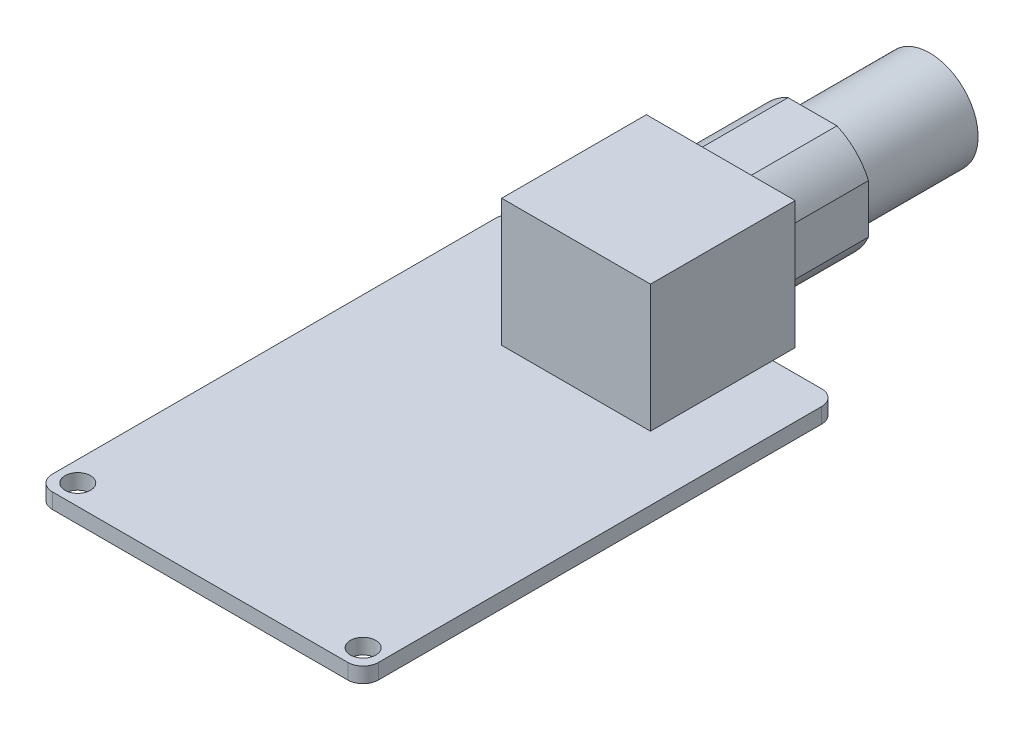
ISO-10303-21;
HEADER;
FILE_DESCRIPTION(('STEP AP214'),'2;1');
FILE_NAME('part.step','',(''),(''),'','','');
FILE_SCHEMA(('AUTOMOTIVE_DESIGN { 1 0 10303 214 1 1 1 1 }'));
ENDSEC;
DATA;
#1=APPLICATION_CONTEXT('core data for automotive mechanical design processes');
#2=APPLICATION_PROTOCOL_DEFINITION('international standard','automotive_design',2000,#1);
#3=PRODUCT_CONTEXT('',#1,'mechanical');
#4=PRODUCT('Part','Part','',(#3));
#5=PRODUCT_RELATED_PRODUCT_CATEGORY('part','',(#4));
#6=PRODUCT_DEFINITION_FORMATION('','',#4);
#7=PRODUCT_DEFINITION_CONTEXT('part definition',#1,'design');
#8=PRODUCT_DEFINITION('design','',#6,#7);
#9=PRODUCT_DEFINITION_SHAPE('','',#8);
#10=(LENGTH_UNIT() NAMED_UNIT(*) SI_UNIT(.MILLI.,.METRE.));
#11=(NAMED_UNIT(*) PLANE_ANGLE_UNIT() SI_UNIT($,.RADIAN.));
#12=(NAMED_UNIT(*) SI_UNIT($,.STERADIAN.) SOLID_ANGLE_UNIT());
#13=UNCERTAINTY_MEASURE_WITH_UNIT(LENGTH_MEASURE(1.E-05),#10,'distance_accuracy_value','');
#14=(GEOMETRIC_REPRESENTATION_CONTEXT(3) GLOBAL_UNCERTAINTY_ASSIGNED_CONTEXT((#13)) GLOBAL_UNIT_ASSIGNED_CONTEXT((#10,
#11,#12)) REPRESENTATION_CONTEXT('',''));
#15=CARTESIAN_POINT('',(0.,0.,0.));
#16=DIRECTION('',(0.,0.,1.));
#17=DIRECTION('',(1.,0.,0.));
#18=AXIS2_PLACEMENT_3D('',#15,#16,#17);
#19=CARTESIAN_POINT('',(-29.3409090909091,31.5,3.5));
#20=DIRECTION('',(0.,0.,-1.));
#21=DIRECTION('',(-1.,0.,0.));
#22=AXIS2_PLACEMENT_3D('',#19,#20,#21);
#23=CYLINDRICAL_SURFACE('',#22,6.);
#24=CARTESIAN_POINT('',(-29.3409090909091,31.5,3.5));
#25=DIRECTION('',(0.,0.,1.));
#26=DIRECTION('',(1.,0.,0.));
#27=AXIS2_PLACEMENT_3D('',#24,#25,#26);
#28=CIRCLE('',#27,6.);
#29=CARTESIAN_POINT('',(-26.9429933292527,26.,3.5));
#30=VERTEX_POINT('',#29);
#31=CARTESIAN_POINT('',(-23.8409090909091,29.1020842383436,3.5));
#32=VERTEX_POINT('',#31);
#33=EDGE_CURVE('E196',#30,#32,#28,.T.);
#34=ORIENTED_EDGE('',*,*,#33,.F.);
#35=DIRECTION('',(0.,0.,-1.));
#36=VECTOR('',#35,1.);
#37=CARTESIAN_POINT('',(-26.9429933292527,26.,8.3218253804965));
#38=LINE('',#37,#36);
#39=CARTESIAN_POINT('',(-26.9429933292527,26.,-5.5));
#40=VERTEX_POINT('',#39);
#41=EDGE_CURVE('E182',#30,#40,#38,.T.);
#42=ORIENTED_EDGE('',*,*,#41,.T.);
#43=CARTESIAN_POINT('',(-29.3409090909091,31.5,-5.5));
#44=DIRECTION('',(0.,0.,1.));
#45=DIRECTION('',(1.,0.,0.));
#46=AXIS2_PLACEMENT_3D('',#43,#44,#45);
#47=CIRCLE('',#46,6.);
#48=CARTESIAN_POINT('',(-23.8409090909091,29.1020842383436,-5.5));
#49=VERTEX_POINT('',#48);
#50=EDGE_CURVE('E195',#40,#49,#47,.T.);
#51=ORIENTED_EDGE('',*,*,#50,.T.);
#52=DIRECTION('',(0.,0.,-1.));
#53=VECTOR('',#52,1.);
#54=CARTESIAN_POINT('',(-23.8409090909091,29.1020842383436,8.3218253804965));
#55=LINE('',#54,#53);
#56=EDGE_CURVE('E231',#32,#49,#55,.T.);
#57=ORIENTED_EDGE('',*,*,#56,.F.);
#58=EDGE_LOOP('',(#34,#42,#51,#57));
#59=FACE_BOUND('',#58,.T.);
#60=ADVANCED_FACE('F33',(#59),#23,.T.);
#61=CARTESIAN_POINT('',(-31.7388248525654,37.,3.5));
#62=VERTEX_POINT('',#61);
#63=CARTESIAN_POINT('',(-34.8409090909091,33.8979157616564,3.5));
#64=VERTEX_POINT('',#63);
#65=EDGE_CURVE('E354',#62,#64,#28,.T.);
#66=ORIENTED_EDGE('',*,*,#65,.F.);
#67=DIRECTION('',(0.,0.,-1.));
#68=VECTOR('',#67,1.);
#69=CARTESIAN_POINT('',(-31.7388248525654,37.,8.3218253804965));
#70=LINE('',#69,#68);
#71=CARTESIAN_POINT('',(-31.7388248525654,37.,-5.5));
#72=VERTEX_POINT('',#71);
#73=EDGE_CURVE('E224',#62,#72,#70,.T.);
#74=ORIENTED_EDGE('',*,*,#73,.T.);
#75=CARTESIAN_POINT('',(-34.8409090909091,33.8979157616564,-5.5));
#76=VERTEX_POINT('',#75);
#77=EDGE_CURVE('E205',#72,#76,#47,.T.);
#78=ORIENTED_EDGE('',*,*,#77,.T.);
#79=DIRECTION('',(0.,0.,-1.));
#80=VECTOR('',#79,1.);
#81=CARTESIAN_POINT('',(-34.8409090909091,33.8979157616564,8.3218253804965));
#82=LINE('',#81,#80);
#83=EDGE_CURVE('E222',#64,#76,#82,.T.);
#84=ORIENTED_EDGE('',*,*,#83,.F.);
#85=EDGE_LOOP('',(#66,#74,#78,#84));
#86=FACE_BOUND('',#85,.T.);
#87=ADVANCED_FACE('F221',(#86),#23,.T.);
#88=CARTESIAN_POINT('',(-34.8409090909091,29.1020842383436,-5.5));
#89=VERTEX_POINT('',#88);
#90=CARTESIAN_POINT('',(-31.7388248525654,26.,-5.5));
#91=VERTEX_POINT('',#90);
#92=EDGE_CURVE('E202',#89,#91,#47,.T.);
#93=ORIENTED_EDGE('',*,*,#92,.T.);
#94=DIRECTION('',(0.,0.,-1.));
#95=VECTOR('',#94,1.);
#96=CARTESIAN_POINT('',(-31.7388248525654,26.,8.3218253804965));
#97=LINE('',#96,#95);
#98=CARTESIAN_POINT('',(-31.7388248525654,26.,3.5));
#99=VERTEX_POINT('',#98);
#100=EDGE_CURVE('E185',#99,#91,#97,.T.);
#101=ORIENTED_EDGE('',*,*,#100,.F.);
#102=CARTESIAN_POINT('',(-34.8409090909091,29.1020842383436,3.5));
#103=VERTEX_POINT('',#102);
#104=EDGE_CURVE('E214',#103,#99,#28,.T.);
#105=ORIENTED_EDGE('',*,*,#104,.F.);
#106=DIRECTION('',(0.,0.,-1.));
#107=VECTOR('',#106,1.);
#108=CARTESIAN_POINT('',(-34.8409090909091,29.1020842383436,8.3218253804965));
#109=LINE('',#108,#107);
#110=EDGE_CURVE('E233',#103,#89,#109,.T.);
#111=ORIENTED_EDGE('',*,*,#110,.T.);
#112=EDGE_LOOP('',(#93,#101,#105,#111));
#113=FACE_BOUND('',#112,.T.);
#114=ADVANCED_FACE('F360',(#113),#23,.T.);
#115=CARTESIAN_POINT('',(-36.6409090909091,25.1,17.7));
#116=DIRECTION('',(0.,1.,0.));
#117=DIRECTION('',(0.,0.,1.));
#118=AXIS2_PLACEMENT_3D('',#115,#116,#117);
#119=PLANE('',#118);
#120=DIRECTION('',(1.,0.,0.));
#121=VECTOR('',#120,1.);
#122=CARTESIAN_POINT('',(-17.2409090909091,25.1,5.69742249083508));
#123=LINE('',#122,#121);
#124=CARTESIAN_POINT('',(-36.6409090909091,25.1,5.69742249083508));
#125=VERTEX_POINT('',#124);
#126=CARTESIAN_POINT('',(-22.0409090909091,25.1,5.69742249083508));
#127=VERTEX_POINT('',#126);
#128=EDGE_CURVE('E11',#125,#127,#123,.T.);
#129=ORIENTED_EDGE('',*,*,#128,.F.);
#130=DIRECTION('',(0.,0.,-1.));
#131=VECTOR('',#130,1.);
#132=CARTESIAN_POINT('',(-36.6409090909091,25.1,17.7));
#133=LINE('',#132,#131);
#134=CARTESIAN_POINT('',(-36.6409090909091,25.1,3.5));
#135=VERTEX_POINT('',#134);
#136=EDGE_CURVE('E342',#125,#135,#133,.T.);
#137=ORIENTED_EDGE('',*,*,#136,.T.);
#138=DIRECTION('',(1.,0.,0.));
#139=VECTOR('',#138,1.);
#140=CARTESIAN_POINT('',(-36.6409090909091,25.1,3.5));
#141=LINE('',#140,#139);
#142=CARTESIAN_POINT('',(-22.0409090909091,25.1,3.5));
#143=VERTEX_POINT('',#142);
#144=EDGE_CURVE('E328',#135,#143,#141,.T.);
#145=ORIENTED_EDGE('',*,*,#144,.T.);
#146=DIRECTION('',(0.,0.,-1.));
#147=VECTOR('',#146,1.);
#148=CARTESIAN_POINT('',(-22.0409090909091,25.1,17.7));
#149=LINE('',#148,#147);
#150=EDGE_CURVE('E339',#127,#143,#149,.T.);
#151=ORIENTED_EDGE('',*,*,#150,.F.);
#152=EDGE_LOOP('',(#129,#137,#145,#151));
#153=FACE_BOUND('',#152,.T.);
#154=ADVANCED_FACE('F388',(#153),#119,.F.);
#155=CARTESIAN_POINT('',(-23.8409090909091,33.8979157616564,-5.5));
#156=VERTEX_POINT('',#155);
#157=CARTESIAN_POINT('',(-26.9429933292527,37.,-5.5));
#158=VERTEX_POINT('',#157);
#159=EDGE_CURVE('E204',#156,#158,#47,.T.);
#160=ORIENTED_EDGE('',*,*,#159,.T.);
#161=DIRECTION('',(0.,0.,-1.));
#162=VECTOR('',#161,1.);
#163=CARTESIAN_POINT('',(-26.9429933292527,37.,8.3218253804965));
#164=LINE('',#163,#162);
#165=CARTESIAN_POINT('',(-26.9429933292527,37.,3.5));
#166=VERTEX_POINT('',#165);
#167=EDGE_CURVE('E190',#166,#158,#164,.T.);
#168=ORIENTED_EDGE('',*,*,#167,.F.);
#169=CARTESIAN_POINT('',(-23.8409090909091,33.8979157616564,3.5));
#170=VERTEX_POINT('',#169);
#171=EDGE_CURVE('E37',#170,#166,#28,.T.);
#172=ORIENTED_EDGE('',*,*,#171,.F.);
#173=DIRECTION('',(0.,0.,-1.));
#174=VECTOR('',#173,1.);
#175=CARTESIAN_POINT('',(-23.8409090909091,33.8979157616564,8.3218253804965));
#176=LINE('',#175,#174);
#177=EDGE_CURVE('E235',#170,#156,#176,.T.);
#178=ORIENTED_EDGE('',*,*,#177,.T.);
#179=EDGE_LOOP('',(#160,#168,#172,#178));
#180=FACE_BOUND('',#179,.T.);
#181=ADVANCED_FACE('F35',(#180),#23,.T.);
#182=CARTESIAN_POINT('',(-29.3409090909091,31.5,-5.5));
#183=DIRECTION('',(0.,0.,1.));
#184=DIRECTION('',(1.,0.,0.));
#185=AXIS2_PLACEMENT_3D('',#182,#183,#184);
#186=PLANE('',#185);
#187=CARTESIAN_POINT('',(-29.3409090909091,31.5,-5.5));
#188=DIRECTION('',(0.,0.,-1.));
#189=DIRECTION('',(-1.,0.,0.));
#190=AXIS2_PLACEMENT_3D('',#187,#188,#189);
#191=CIRCLE('',#190,4.75000000000001);
#192=CARTESIAN_POINT('',(-34.0909090909091,31.5,-5.5));
#193=VERTEX_POINT('',#192);
#194=EDGE_CURVE('E42',#193,#193,#191,.T.);
#195=ORIENTED_EDGE('',*,*,#194,.F.);
#196=EDGE_LOOP('',(#195));
#197=FACE_BOUND('',#196,.T.);
#198=ORIENTED_EDGE('',*,*,#50,.F.);
#199=DIRECTION('',(1.,0.,0.));
#200=VECTOR('',#199,1.);
#201=CARTESIAN_POINT('',(-26.9429933292527,26.,-5.5));
#202=LINE('',#201,#200);
#203=EDGE_CURVE('E179',#91,#40,#202,.T.);
#204=ORIENTED_EDGE('',*,*,#203,.F.);
#205=ORIENTED_EDGE('',*,*,#92,.F.);
#206=DIRECTION('',(0.,-1.,0.));
#207=VECTOR('',#206,1.);
#208=CARTESIAN_POINT('',(-34.8409090909091,29.1020842383436,-5.5));
#209=LINE('',#208,#207);
#210=EDGE_CURVE('E228',#76,#89,#209,.T.);
#211=ORIENTED_EDGE('',*,*,#210,.F.);
#212=ORIENTED_EDGE('',*,*,#77,.F.);
#213=DIRECTION('',(-1.,0.,0.));
#214=VECTOR('',#213,1.);
#215=CARTESIAN_POINT('',(-26.9429933292527,37.,-5.5));
#216=LINE('',#215,#214);
#217=EDGE_CURVE('E227',#158,#72,#216,.T.);
#218=ORIENTED_EDGE('',*,*,#217,.F.);
#219=ORIENTED_EDGE('',*,*,#159,.F.);
#220=DIRECTION('',(0.,1.,0.));
#221=VECTOR('',#220,1.);
#222=CARTESIAN_POINT('',(-23.8409090909091,29.1020842383436,-5.5));
#223=LINE('',#222,#221);
#224=EDGE_CURVE('E201',#49,#156,#223,.T.);
#225=ORIENTED_EDGE('',*,*,#224,.F.);
#226=EDGE_LOOP('',(#198,#204,#205,#211,#212,#218,#219,#225));
#227=FACE_BOUND('',#226,.T.);
#228=ADVANCED_FACE('F199',(#197,#227),#186,.F.);
#229=CARTESIAN_POINT('',(-29.3409090909091,31.5,-17.));
#230=DIRECTION('',(0.,0.,1.));
#231=DIRECTION('',(1.,0.,0.));
#232=AXIS2_PLACEMENT_3D('',#229,#230,#231);
#233=CYLINDRICAL_SURFACE('',#232,4.75000000000001);
#234=CARTESIAN_POINT('',(-29.3409090909091,31.5,-17.));
#235=DIRECTION('',(0.,0.,-1.));
#236=DIRECTION('',(-1.,0.,0.));
#237=AXIS2_PLACEMENT_3D('',#234,#235,#236);
#238=CIRCLE('',#237,4.75000000000001);
#239=CARTESIAN_POINT('',(-34.0909090909091,31.5,-17.));
#240=VERTEX_POINT('',#239);
#241=EDGE_CURVE('E203',#240,#240,#238,.T.);
#242=ORIENTED_EDGE('',*,*,#241,.F.);
#243=EDGE_LOOP('',(#242));
#244=FACE_BOUND('',#243,.T.);
#245=ORIENTED_EDGE('',*,*,#194,.T.);
#246=EDGE_LOOP('',(#245));
#247=FACE_BOUND('',#246,.T.);
#248=ADVANCED_FACE('F393',(#244,#247),#233,.T.);
#249=CARTESIAN_POINT('',(-29.3409090909091,31.5,-17.));
#250=DIRECTION('',(0.,0.,-1.));
#251=DIRECTION('',(-1.,0.,0.));
#252=AXIS2_PLACEMENT_3D('',#249,#250,#251);
#253=PLANE('',#252);
#254=CARTESIAN_POINT('',(-29.3409090909091,31.5,-17.));
#255=DIRECTION('',(0.,0.,-1.));
#256=DIRECTION('',(-1.,0.,0.));
#257=AXIS2_PLACEMENT_3D('',#254,#255,#256);
#258=CIRCLE('',#257,4.25000000000001);
#259=CARTESIAN_POINT('',(-33.5909090909091,31.5,-17.));
#260=VERTEX_POINT('',#259);
#261=EDGE_CURVE('E346',#260,#260,#258,.T.);
#262=ORIENTED_EDGE('',*,*,#261,.F.);
#263=EDGE_LOOP('',(#262));
#264=FACE_BOUND('',#263,.T.);
#265=ORIENTED_EDGE('',*,*,#241,.T.);
#266=EDGE_LOOP('',(#265));
#267=FACE_BOUND('',#266,.T.);
#268=ADVANCED_FACE('F626',(#264,#267),#253,.T.);
#269=CARTESIAN_POINT('',(-29.3409090909091,31.5,-5.5));
#270=DIRECTION('',(0.,0.,-1.));
#271=DIRECTION('',(-1.,0.,0.));
#272=AXIS2_PLACEMENT_3D('',#269,#270,#271);
#273=CYLINDRICAL_SURFACE('',#272,4.25000000000001);
#274=CARTESIAN_POINT('',(-29.3409090909091,31.5,-5.5));
#275=DIRECTION('',(0.,0.,-1.));
#276=DIRECTION('',(-1.,0.,0.));
#277=AXIS2_PLACEMENT_3D('',#274,#275,#276);
#278=CIRCLE('',#277,4.25000000000001);
#279=CARTESIAN_POINT('',(-33.5909090909091,31.5,-5.5));
#280=VERTEX_POINT('',#279);
#281=EDGE_CURVE('E207',#280,#280,#278,.T.);
#282=ORIENTED_EDGE('',*,*,#281,.F.);
#283=EDGE_LOOP('',(#282));
#284=FACE_BOUND('',#283,.T.);
#285=ORIENTED_EDGE('',*,*,#261,.T.);
#286=EDGE_LOOP('',(#285));
#287=FACE_BOUND('',#286,.T.);
#288=ADVANCED_FACE('F633',(#284,#287),#273,.F.);
#289=CARTESIAN_POINT('',(-29.3409090909091,31.5,-5.5));
#290=DIRECTION('',(0.,0.,-1.));
#291=DIRECTION('',(-1.,0.,0.));
#292=AXIS2_PLACEMENT_3D('',#289,#290,#291);
#293=PLANE('',#292);
#294=ORIENTED_EDGE('',*,*,#281,.T.);
#295=EDGE_LOOP('',(#294));
#296=FACE_BOUND('',#295,.T.);
#297=ADVANCED_FACE('F425',(#296),#293,.T.);
#298=CARTESIAN_POINT('',(-36.6409090909091,37.6,17.7));
#299=DIRECTION('',(1.,0.,0.));
#300=DIRECTION('',(0.,1.,0.));
#301=AXIS2_PLACEMENT_3D('',#298,#299,#300);
#302=PLANE('',#301);
#303=DIRECTION('',(0.,-1.,0.));
#304=VECTOR('',#303,1.);
#305=CARTESIAN_POINT('',(-36.6409090909091,37.6,3.5));
#306=LINE('',#305,#304);
#307=CARTESIAN_POINT('',(-36.6409090909091,37.6,3.5));
#308=VERTEX_POINT('',#307);
#309=EDGE_CURVE('E315',#308,#135,#306,.T.);
#310=ORIENTED_EDGE('',*,*,#309,.T.);
#311=ORIENTED_EDGE('',*,*,#136,.F.);
#312=CARTESIAN_POINT('',(-36.6409090909091,25.1,17.7));
#313=VERTEX_POINT('',#312);
#314=EDGE_CURVE('E343',#313,#125,#133,.T.);
#315=ORIENTED_EDGE('',*,*,#314,.F.);
#316=DIRECTION('',(0.,-1.,0.));
#317=VECTOR('',#316,1.);
#318=CARTESIAN_POINT('',(-36.6409090909091,37.6,17.7));
#319=LINE('',#318,#317);
#320=CARTESIAN_POINT('',(-36.6409090909091,37.6,17.7));
#321=VERTEX_POINT('',#320);
#322=EDGE_CURVE('E316',#321,#313,#319,.T.);
#323=ORIENTED_EDGE('',*,*,#322,.F.);
#324=DIRECTION('',(0.,0.,-1.));
#325=VECTOR('',#324,1.);
#326=CARTESIAN_POINT('',(-36.6409090909091,37.6,17.7));
#327=LINE('',#326,#325);
#328=EDGE_CURVE('E325',#321,#308,#327,.T.);
#329=ORIENTED_EDGE('',*,*,#328,.T.);
#330=EDGE_LOOP('',(#310,#311,#315,#323,#329));
#331=FACE_BOUND('',#330,.T.);
#332=ADVANCED_FACE('F419',(#331),#302,.F.);
#333=CARTESIAN_POINT('',(-22.0409090909091,37.6,17.7));
#334=DIRECTION('',(-1.,0.,0.));
#335=DIRECTION('',(0.,0.,1.));
#336=AXIS2_PLACEMENT_3D('',#333,#334,#335);
#337=PLANE('',#336);
#338=DIRECTION('',(0.,1.,0.));
#339=VECTOR('',#338,1.);
#340=CARTESIAN_POINT('',(-22.0409090909091,37.6,3.5));
#341=LINE('',#340,#339);
#342=CARTESIAN_POINT('',(-22.0409090909091,37.6,3.5));
#343=VERTEX_POINT('',#342);
#344=EDGE_CURVE('E331',#143,#343,#341,.T.);
#345=ORIENTED_EDGE('',*,*,#344,.T.);
#346=DIRECTION('',(0.,0.,-1.));
#347=VECTOR('',#346,1.);
#348=CARTESIAN_POINT('',(-22.0409090909091,37.6,17.7));
#349=LINE('',#348,#347);
#350=CARTESIAN_POINT('',(-22.0409090909091,37.6,17.7));
#351=VERTEX_POINT('',#350);
#352=EDGE_CURVE('E336',#351,#343,#349,.T.);
#353=ORIENTED_EDGE('',*,*,#352,.F.);
#354=DIRECTION('',(0.,1.,0.));
#355=VECTOR('',#354,1.);
#356=CARTESIAN_POINT('',(-22.0409090909091,37.6,17.7));
#357=LINE('',#356,#355);
#358=CARTESIAN_POINT('',(-22.0409090909091,25.1,17.7));
#359=VERTEX_POINT('',#358);
#360=EDGE_CURVE('E321',#359,#351,#357,.T.);
#361=ORIENTED_EDGE('',*,*,#360,.F.);
#362=EDGE_CURVE('E340',#359,#127,#149,.T.);
#363=ORIENTED_EDGE('',*,*,#362,.T.);
#364=ORIENTED_EDGE('',*,*,#150,.T.);
#365=EDGE_LOOP('',(#345,#353,#361,#363,#364));
#366=FACE_BOUND('',#365,.T.);
#367=ADVANCED_FACE('F424',(#366),#337,.F.);
#368=CARTESIAN_POINT('',(-36.6409090909091,37.6,17.7));
#369=DIRECTION('',(0.,-1.,0.));
#370=DIRECTION('',(0.,0.,-1.));
#371=AXIS2_PLACEMENT_3D('',#368,#369,#370);
#372=PLANE('',#371);
#373=DIRECTION('',(-1.,0.,0.));
#374=VECTOR('',#373,1.);
#375=CARTESIAN_POINT('',(-36.6409090909091,37.6,3.5));
#376=LINE('',#375,#374);
#377=EDGE_CURVE('E319',#343,#308,#376,.T.);
#378=ORIENTED_EDGE('',*,*,#377,.T.);
#379=ORIENTED_EDGE('',*,*,#328,.F.);
#380=DIRECTION('',(-1.,0.,0.));
#381=VECTOR('',#380,1.);
#382=CARTESIAN_POINT('',(-36.6409090909091,37.6,17.7));
#383=LINE('',#382,#381);
#384=EDGE_CURVE('E323',#351,#321,#383,.T.);
#385=ORIENTED_EDGE('',*,*,#384,.F.);
#386=ORIENTED_EDGE('',*,*,#352,.T.);
#387=EDGE_LOOP('',(#378,#379,#385,#386));
#388=FACE_BOUND('',#387,.T.);
#389=ADVANCED_FACE('F414',(#388),#372,.F.);
#390=CARTESIAN_POINT('',(0.,0.,17.7));
#391=DIRECTION('',(0.,0.,1.));
#392=DIRECTION('',(1.,0.,0.));
#393=AXIS2_PLACEMENT_3D('',#390,#391,#392);
#394=PLANE('',#393);
#395=ORIENTED_EDGE('',*,*,#322,.T.);
#396=DIRECTION('',(1.,0.,0.));
#397=VECTOR('',#396,1.);
#398=CARTESIAN_POINT('',(-36.6409090909091,25.1,17.7));
#399=LINE('',#398,#397);
#400=EDGE_CURVE('E318',#313,#359,#399,.T.);
#401=ORIENTED_EDGE('',*,*,#400,.T.);
#402=ORIENTED_EDGE('',*,*,#360,.T.);
#403=ORIENTED_EDGE('',*,*,#384,.T.);
#404=EDGE_LOOP('',(#395,#401,#402,#403));
#405=FACE_BOUND('',#404,.T.);
#406=ADVANCED_FACE('F442',(#405),#394,.T.);
#407=CARTESIAN_POINT('',(0.,0.,3.5));
#408=DIRECTION('',(0.,0.,1.));
#409=DIRECTION('',(1.,0.,0.));
#410=AXIS2_PLACEMENT_3D('',#407,#408,#409);
#411=PLANE('',#410);
#412=ORIENTED_EDGE('',*,*,#171,.T.);
#413=DIRECTION('',(-1.,0.,0.));
#414=VECTOR('',#413,1.);
#415=CARTESIAN_POINT('',(-26.9429933292527,37.,3.5));
#416=LINE('',#415,#414);
#417=EDGE_CURVE('E365',#166,#62,#416,.T.);
#418=ORIENTED_EDGE('',*,*,#417,.T.);
#419=ORIENTED_EDGE('',*,*,#65,.T.);
#420=DIRECTION('',(0.,-1.,0.));
#421=VECTOR('',#420,1.);
#422=CARTESIAN_POINT('',(-34.8409090909091,29.1020842383436,3.5));
#423=LINE('',#422,#421);
#424=EDGE_CURVE('E58',#64,#103,#423,.T.);
#425=ORIENTED_EDGE('',*,*,#424,.T.);
#426=ORIENTED_EDGE('',*,*,#104,.T.);
#427=DIRECTION('',(1.,0.,0.));
#428=VECTOR('',#427,1.);
#429=CARTESIAN_POINT('',(-26.9429933292527,26.,3.5));
#430=LINE('',#429,#428);
#431=EDGE_CURVE('E52',#99,#30,#430,.T.);
#432=ORIENTED_EDGE('',*,*,#431,.T.);
#433=ORIENTED_EDGE('',*,*,#33,.T.);
#434=DIRECTION('',(0.,1.,0.));
#435=VECTOR('',#434,1.);
#436=CARTESIAN_POINT('',(-23.8409090909091,29.1020842383436,3.5));
#437=LINE('',#436,#435);
#438=EDGE_CURVE('E243',#32,#170,#437,.T.);
#439=ORIENTED_EDGE('',*,*,#438,.T.);
#440=EDGE_LOOP('',(#412,#418,#419,#425,#426,#432,#433,#439));
#441=FACE_BOUND('',#440,.T.);
#442=ORIENTED_EDGE('',*,*,#309,.F.);
#443=ORIENTED_EDGE('',*,*,#377,.F.);
#444=ORIENTED_EDGE('',*,*,#344,.F.);
#445=ORIENTED_EDGE('',*,*,#144,.F.);
#446=EDGE_LOOP('',(#442,#443,#444,#445));
#447=FACE_BOUND('',#446,.T.);
#448=ADVANCED_FACE('F357',(#441,#447),#411,.F.);
#449=CARTESIAN_POINT('',(-17.2409090909091,23.6,50.6974224908351));
#450=DIRECTION('',(0.,-1.,0.));
#451=DIRECTION('',(0.,0.,-1.));
#452=AXIS2_PLACEMENT_3D('',#449,#450,#451);
#453=PLANE('',#452);
#454=CARTESIAN_POINT('',(-17.7409090909091,23.6,50.1974224908351));
#455=DIRECTION('',(0.,-1.,0.));
#456=DIRECTION('',(0.,0.,-1.));
#457=AXIS2_PLACEMENT_3D('',#454,#455,#456);
#458=CIRCLE('',#457,1.25);
#459=CARTESIAN_POINT('',(-17.7409090909091,23.6,48.9474224908351));
#460=VERTEX_POINT('',#459);
#461=EDGE_CURVE('E253',#460,#460,#458,.T.);
#462=ORIENTED_EDGE('',*,*,#461,.F.);
#463=EDGE_LOOP('',(#462));
#464=FACE_BOUND('',#463,.T.);
#465=CARTESIAN_POINT('',(-17.2409090909091,23.6,50.6974224908351));
#466=DIRECTION('',(0.,-1.,0.));
#467=DIRECTION('',(0.,0.,-1.));
#468=AXIS2_PLACEMENT_3D('',#465,#466,#467);
#469=CIRCLE('',#468,1.5);
#470=CARTESIAN_POINT('',(-15.7409090909091,23.6,50.6974224908351));
#471=VERTEX_POINT('',#470);
#472=CARTESIAN_POINT('',(-17.2409090909091,23.6,52.1974224908351));
#473=VERTEX_POINT('',#472);
#474=EDGE_CURVE('E259',#471,#473,#469,.T.);
#475=ORIENTED_EDGE('',*,*,#474,.T.);
#476=DIRECTION('',(-1.,0.,0.));
#477=VECTOR('',#476,1.);
#478=CARTESIAN_POINT('',(-17.2409090909091,23.6,52.1974224908351));
#479=LINE('',#478,#477);
#480=CARTESIAN_POINT('',(-46.2409090909091,23.6,52.1974224908351));
#481=VERTEX_POINT('',#480);
#482=EDGE_CURVE('E262',#473,#481,#479,.T.);
#483=ORIENTED_EDGE('',*,*,#482,.T.);
#484=CARTESIAN_POINT('',(-46.2409090909091,23.6,50.6974224908351));
#485=DIRECTION('',(0.,-1.,0.));
#486=DIRECTION('',(0.,0.,-1.));
#487=AXIS2_PLACEMENT_3D('',#484,#485,#486);
#488=CIRCLE('',#487,1.5);
#489=CARTESIAN_POINT('',(-47.7409090909091,23.6,50.6974224908351));
#490=VERTEX_POINT('',#489);
#491=EDGE_CURVE('E265',#481,#490,#488,.T.);
#492=ORIENTED_EDGE('',*,*,#491,.T.);
#493=DIRECTION('',(0.,0.,-1.));
#494=VECTOR('',#493,1.);
#495=CARTESIAN_POINT('',(-47.7409090909091,23.6,7.19742249083508));
#496=LINE('',#495,#494);
#497=CARTESIAN_POINT('',(-47.7409090909091,23.6,7.19742249083508));
#498=VERTEX_POINT('',#497);
#499=EDGE_CURVE('E267',#490,#498,#496,.T.);
#500=ORIENTED_EDGE('',*,*,#499,.T.);
#501=CARTESIAN_POINT('',(-46.2409090909091,23.6,7.19742249083508));
#502=DIRECTION('',(0.,-1.,0.));
#503=DIRECTION('',(0.,0.,1.));
#504=AXIS2_PLACEMENT_3D('',#501,#502,#503);
#505=CIRCLE('',#504,1.5);
#506=CARTESIAN_POINT('',(-46.2409090909091,23.6,5.69742249083507));
#507=VERTEX_POINT('',#506);
#508=EDGE_CURVE('E269',#498,#507,#505,.T.);
#509=ORIENTED_EDGE('',*,*,#508,.T.);
#510=DIRECTION('',(1.,0.,0.));
#511=VECTOR('',#510,1.);
#512=CARTESIAN_POINT('',(-17.2409090909091,23.6,5.69742249083508));
#513=LINE('',#512,#511);
#514=CARTESIAN_POINT('',(-17.2409090909091,23.6,5.69742249083508));
#515=VERTEX_POINT('',#514);
#516=EDGE_CURVE('E271',#507,#515,#513,.T.);
#517=ORIENTED_EDGE('',*,*,#516,.T.);
#518=CARTESIAN_POINT('',(-17.2409090909091,23.6,7.19742249083508));
#519=DIRECTION('',(0.,-1.,0.));
#520=DIRECTION('',(0.,0.,-1.));
#521=AXIS2_PLACEMENT_3D('',#518,#519,#520);
#522=CIRCLE('',#521,1.5);
#523=CARTESIAN_POINT('',(-15.7409090909091,23.6,7.19742249083508));
#524=VERTEX_POINT('',#523);
#525=EDGE_CURVE('E273',#515,#524,#522,.T.);
#526=ORIENTED_EDGE('',*,*,#525,.T.);
#527=DIRECTION('',(0.,0.,1.));
#528=VECTOR('',#527,1.);
#529=CARTESIAN_POINT('',(-15.7409090909091,23.6,7.19742249083508));
#530=LINE('',#529,#528);
#531=EDGE_CURVE('E275',#524,#471,#530,.T.);
#532=ORIENTED_EDGE('',*,*,#531,.T.);
#533=EDGE_LOOP('',(#475,#483,#492,#500,#509,#517,#526,#532));
#534=FACE_BOUND('',#533,.T.);
#535=CARTESIAN_POINT('',(-45.7409090909091,23.6,50.1974224908351));
#536=DIRECTION('',(0.,-1.,0.));
#537=DIRECTION('',(0.,0.,-1.));
#538=AXIS2_PLACEMENT_3D('',#535,#536,#537);
#539=CIRCLE('',#538,1.25);
#540=CARTESIAN_POINT('',(-45.7409090909091,23.6,48.9474224908351));
#541=VERTEX_POINT('',#540);
#542=EDGE_CURVE('E246',#541,#541,#539,.T.);
#543=ORIENTED_EDGE('',*,*,#542,.F.);
#544=EDGE_LOOP('',(#543));
#545=FACE_BOUND('',#544,.T.);
#546=ADVANCED_FACE('F453',(#464,#534,#545),#453,.T.);
#547=CARTESIAN_POINT('',(-17.2409090909091,25.1,50.6974224908351));
#548=DIRECTION('',(0.,-1.,0.));
#549=DIRECTION('',(0.,0.,-1.));
#550=AXIS2_PLACEMENT_3D('',#547,#548,#549);
#551=PLANE('',#550);
#552=ORIENTED_EDGE('',*,*,#362,.F.);
#553=ORIENTED_EDGE('',*,*,#400,.F.);
#554=ORIENTED_EDGE('',*,*,#314,.T.);
#555=CARTESIAN_POINT('',(-46.2409090909091,25.1,5.69742249083507));
#556=VERTEX_POINT('',#555);
#557=EDGE_CURVE('E44',#556,#125,#123,.T.);
#558=ORIENTED_EDGE('',*,*,#557,.F.);
#559=CARTESIAN_POINT('',(-46.2409090909091,25.1,7.19742249083508));
#560=DIRECTION('',(0.,-1.,0.));
#561=DIRECTION('',(0.,0.,1.));
#562=AXIS2_PLACEMENT_3D('',#559,#560,#561);
#563=CIRCLE('',#562,1.5);
#564=CARTESIAN_POINT('',(-47.7409090909091,25.1,7.19742249083508));
#565=VERTEX_POINT('',#564);
#566=EDGE_CURVE('E286',#565,#556,#563,.T.);
#567=ORIENTED_EDGE('',*,*,#566,.F.);
#568=DIRECTION('',(0.,0.,-1.));
#569=VECTOR('',#568,1.);
#570=CARTESIAN_POINT('',(-47.7409090909091,25.1,7.19742249083508));
#571=LINE('',#570,#569);
#572=CARTESIAN_POINT('',(-47.7409090909091,25.1,50.6974224908351));
#573=VERTEX_POINT('',#572);
#574=EDGE_CURVE('E284',#573,#565,#571,.T.);
#575=ORIENTED_EDGE('',*,*,#574,.F.);
#576=CARTESIAN_POINT('',(-46.2409090909091,25.1,50.6974224908351));
#577=DIRECTION('',(0.,-1.,0.));
#578=DIRECTION('',(0.,0.,-1.));
#579=AXIS2_PLACEMENT_3D('',#576,#577,#578);
#580=CIRCLE('',#579,1.5);
#581=CARTESIAN_POINT('',(-46.2409090909091,25.1,52.1974224908351));
#582=VERTEX_POINT('',#581);
#583=EDGE_CURVE('E282',#582,#573,#580,.T.);
#584=ORIENTED_EDGE('',*,*,#583,.F.);
#585=DIRECTION('',(-1.,0.,0.));
#586=VECTOR('',#585,1.);
#587=CARTESIAN_POINT('',(-17.2409090909091,25.1,52.1974224908351));
#588=LINE('',#587,#586);
#589=CARTESIAN_POINT('',(-17.2409090909091,25.1,52.1974224908351));
#590=VERTEX_POINT('',#589);
#591=EDGE_CURVE('E280',#590,#582,#588,.T.);
#592=ORIENTED_EDGE('',*,*,#591,.F.);
#593=CARTESIAN_POINT('',(-17.2409090909091,25.1,50.6974224908351));
#594=DIRECTION('',(0.,-1.,0.));
#595=DIRECTION('',(0.,0.,-1.));
#596=AXIS2_PLACEMENT_3D('',#593,#594,#595);
#597=CIRCLE('',#596,1.5);
#598=CARTESIAN_POINT('',(-15.7409090909091,25.1,50.6974224908351));
#599=VERTEX_POINT('',#598);
#600=EDGE_CURVE('E256',#599,#590,#597,.T.);
#601=ORIENTED_EDGE('',*,*,#600,.F.);
#602=DIRECTION('',(0.,0.,1.));
#603=VECTOR('',#602,1.);
#604=CARTESIAN_POINT('',(-15.7409090909091,25.1,7.19742249083508));
#605=LINE('',#604,#603);
#606=CARTESIAN_POINT('',(-15.7409090909091,25.1,7.19742249083508));
#607=VERTEX_POINT('',#606);
#608=EDGE_CURVE('E263',#607,#599,#605,.T.);
#609=ORIENTED_EDGE('',*,*,#608,.F.);
#610=CARTESIAN_POINT('',(-17.2409090909091,25.1,7.19742249083508));
#611=DIRECTION('',(0.,-1.,0.));
#612=DIRECTION('',(0.,0.,-1.));
#613=AXIS2_PLACEMENT_3D('',#610,#611,#612);
#614=CIRCLE('',#613,1.5);
#615=CARTESIAN_POINT('',(-17.2409090909091,25.1,5.69742249083508));
#616=VERTEX_POINT('',#615);
#617=EDGE_CURVE('E289',#616,#607,#614,.T.);
#618=ORIENTED_EDGE('',*,*,#617,.F.);
#619=EDGE_CURVE('E45',#127,#616,#123,.T.);
#620=ORIENTED_EDGE('',*,*,#619,.F.);
#621=EDGE_LOOP('',(#552,#553,#554,#558,#567,#575,#584,#592,#601,#609,#618,#620));
#622=FACE_BOUND('',#621,.T.);
#623=CARTESIAN_POINT('',(-17.7409090909091,25.1,50.1974224908351));
#624=DIRECTION('',(0.,-1.,0.));
#625=DIRECTION('',(0.,0.,-1.));
#626=AXIS2_PLACEMENT_3D('',#623,#624,#625);
#627=CIRCLE('',#626,1.25);
#628=CARTESIAN_POINT('',(-17.7409090909091,25.1,48.9474224908351));
#629=VERTEX_POINT('',#628);
#630=EDGE_CURVE('E249',#629,#629,#627,.T.);
#631=ORIENTED_EDGE('',*,*,#630,.T.);
#632=EDGE_LOOP('',(#631));
#633=FACE_BOUND('',#632,.T.);
#634=CARTESIAN_POINT('',(-45.7409090909091,25.1,50.1974224908351));
#635=DIRECTION('',(0.,-1.,0.));
#636=DIRECTION('',(0.,0.,-1.));
#637=AXIS2_PLACEMENT_3D('',#634,#635,#636);
#638=CIRCLE('',#637,1.25);
#639=CARTESIAN_POINT('',(-45.7409090909091,25.1,48.9474224908351));
#640=VERTEX_POINT('',#639);
#641=EDGE_CURVE('E250',#640,#640,#638,.T.);
#642=ORIENTED_EDGE('',*,*,#641,.T.);
#643=EDGE_LOOP('',(#642));
#644=FACE_BOUND('',#643,.T.);
#645=ADVANCED_FACE('F457',(#622,#633,#644),#551,.F.);
#646=CARTESIAN_POINT('',(-17.2409090909091,23.6,50.6974224908351));
#647=DIRECTION('',(0.,1.,0.));
#648=DIRECTION('',(0.,0.,1.));
#649=AXIS2_PLACEMENT_3D('',#646,#647,#648);
#650=CYLINDRICAL_SURFACE('',#649,1.5);
#651=ORIENTED_EDGE('',*,*,#600,.T.);
#652=DIRECTION('',(0.,1.,0.));
#653=VECTOR('',#652,1.);
#654=CARTESIAN_POINT('',(-17.2409090909091,23.6,52.1974224908351));
#655=LINE('',#654,#653);
#656=EDGE_CURVE('E312',#473,#590,#655,.T.);
#657=ORIENTED_EDGE('',*,*,#656,.F.);
#658=ORIENTED_EDGE('',*,*,#474,.F.);
#659=DIRECTION('',(0.,1.,0.));
#660=VECTOR('',#659,1.);
#661=CARTESIAN_POINT('',(-15.7409090909091,23.6,50.6974224908351));
#662=LINE('',#661,#660);
#663=EDGE_CURVE('E277',#471,#599,#662,.T.);
#664=ORIENTED_EDGE('',*,*,#663,.T.);
#665=EDGE_LOOP('',(#651,#657,#658,#664));
#666=FACE_BOUND('',#665,.T.);
#667=ADVANCED_FACE('F467',(#666),#650,.T.);
#668=CARTESIAN_POINT('',(-17.2409090909091,23.6,52.1974224908351));
#669=DIRECTION('',(0.,0.,-1.));
#670=DIRECTION('',(-1.,0.,0.));
#671=AXIS2_PLACEMENT_3D('',#668,#669,#670);
#672=PLANE('',#671);
#673=ORIENTED_EDGE('',*,*,#591,.T.);
#674=DIRECTION('',(0.,1.,0.));
#675=VECTOR('',#674,1.);
#676=CARTESIAN_POINT('',(-46.2409090909091,23.6,52.1974224908351));
#677=LINE('',#676,#675);
#678=EDGE_CURVE('E309',#481,#582,#677,.T.);
#679=ORIENTED_EDGE('',*,*,#678,.F.);
#680=ORIENTED_EDGE('',*,*,#482,.F.);
#681=ORIENTED_EDGE('',*,*,#656,.T.);
#682=EDGE_LOOP('',(#673,#679,#680,#681));
#683=FACE_BOUND('',#682,.T.);
#684=ADVANCED_FACE('F477',(#683),#672,.F.);
#685=CARTESIAN_POINT('',(-46.2409090909091,23.6,50.6974224908351));
#686=DIRECTION('',(0.,1.,0.));
#687=DIRECTION('',(0.,0.,1.));
#688=AXIS2_PLACEMENT_3D('',#685,#686,#687);
#689=CYLINDRICAL_SURFACE('',#688,1.5);
#690=ORIENTED_EDGE('',*,*,#583,.T.);
#691=DIRECTION('',(0.,1.,0.));
#692=VECTOR('',#691,1.);
#693=CARTESIAN_POINT('',(-47.7409090909091,23.6,50.6974224908351));
#694=LINE('',#693,#692);
#695=EDGE_CURVE('E306',#490,#573,#694,.T.);
#696=ORIENTED_EDGE('',*,*,#695,.F.);
#697=ORIENTED_EDGE('',*,*,#491,.F.);
#698=ORIENTED_EDGE('',*,*,#678,.T.);
#699=EDGE_LOOP('',(#690,#696,#697,#698));
#700=FACE_BOUND('',#699,.T.);
#701=ADVANCED_FACE('F487',(#700),#689,.T.);
#702=CARTESIAN_POINT('',(-47.7409090909091,23.6,7.19742249083508));
#703=DIRECTION('',(1.,0.,0.));
#704=DIRECTION('',(0.,0.,-1.));
#705=AXIS2_PLACEMENT_3D('',#702,#703,#704);
#706=PLANE('',#705);
#707=ORIENTED_EDGE('',*,*,#574,.T.);
#708=DIRECTION('',(0.,1.,0.));
#709=VECTOR('',#708,1.);
#710=CARTESIAN_POINT('',(-47.7409090909091,23.6,7.19742249083508));
#711=LINE('',#710,#709);
#712=EDGE_CURVE('E303',#498,#565,#711,.T.);
#713=ORIENTED_EDGE('',*,*,#712,.F.);
#714=ORIENTED_EDGE('',*,*,#499,.F.);
#715=ORIENTED_EDGE('',*,*,#695,.T.);
#716=EDGE_LOOP('',(#707,#713,#714,#715));
#717=FACE_BOUND('',#716,.T.);
#718=ADVANCED_FACE('F497',(#717),#706,.F.);
#719=CARTESIAN_POINT('',(-46.2409090909091,23.6,7.19742249083508));
#720=DIRECTION('',(0.,1.,0.));
#721=DIRECTION('',(0.,0.,1.));
#722=AXIS2_PLACEMENT_3D('',#719,#720,#721);
#723=CYLINDRICAL_SURFACE('',#722,1.5);
#724=ORIENTED_EDGE('',*,*,#566,.T.);
#725=DIRECTION('',(0.,1.,0.));
#726=VECTOR('',#725,1.);
#727=CARTESIAN_POINT('',(-46.2409090909091,23.6,5.69742249083507));
#728=LINE('',#727,#726);
#729=EDGE_CURVE('E300',#507,#556,#728,.T.);
#730=ORIENTED_EDGE('',*,*,#729,.F.);
#731=ORIENTED_EDGE('',*,*,#508,.F.);
#732=ORIENTED_EDGE('',*,*,#712,.T.);
#733=EDGE_LOOP('',(#724,#730,#731,#732));
#734=FACE_BOUND('',#733,.T.);
#735=ADVANCED_FACE('F507',(#734),#723,.T.);
#736=CARTESIAN_POINT('',(-17.2409090909091,23.6,5.69742249083508));
#737=DIRECTION('',(0.,0.,1.));
#738=DIRECTION('',(1.,0.,0.));
#739=AXIS2_PLACEMENT_3D('',#736,#737,#738);
#740=PLANE('',#739);
#741=ORIENTED_EDGE('',*,*,#557,.T.);
#742=ORIENTED_EDGE('',*,*,#128,.T.);
#743=ORIENTED_EDGE('',*,*,#619,.T.);
#744=DIRECTION('',(0.,1.,0.));
#745=VECTOR('',#744,1.);
#746=CARTESIAN_POINT('',(-17.2409090909091,23.6,5.69742249083508));
#747=LINE('',#746,#745);
#748=EDGE_CURVE('E297',#515,#616,#747,.T.);
#749=ORIENTED_EDGE('',*,*,#748,.F.);
#750=ORIENTED_EDGE('',*,*,#516,.F.);
#751=ORIENTED_EDGE('',*,*,#729,.T.);
#752=EDGE_LOOP('',(#741,#742,#743,#749,#750,#751));
#753=FACE_BOUND('',#752,.T.);
#754=ADVANCED_FACE('F517',(#753),#740,.F.);
#755=CARTESIAN_POINT('',(-17.2409090909091,23.6,7.19742249083508));
#756=DIRECTION('',(0.,1.,0.));
#757=DIRECTION('',(0.,0.,1.));
#758=AXIS2_PLACEMENT_3D('',#755,#756,#757);
#759=CYLINDRICAL_SURFACE('',#758,1.5);
#760=ORIENTED_EDGE('',*,*,#617,.T.);
#761=DIRECTION('',(0.,1.,0.));
#762=VECTOR('',#761,1.);
#763=CARTESIAN_POINT('',(-15.7409090909091,23.6,7.19742249083508));
#764=LINE('',#763,#762);
#765=EDGE_CURVE('E294',#524,#607,#764,.T.);
#766=ORIENTED_EDGE('',*,*,#765,.F.);
#767=ORIENTED_EDGE('',*,*,#525,.F.);
#768=ORIENTED_EDGE('',*,*,#748,.T.);
#769=EDGE_LOOP('',(#760,#766,#767,#768));
#770=FACE_BOUND('',#769,.T.);
#771=ADVANCED_FACE('F527',(#770),#759,.T.);
#772=CARTESIAN_POINT('',(-15.7409090909091,23.6,7.19742249083508));
#773=DIRECTION('',(-1.,0.,0.));
#774=DIRECTION('',(0.,0.,1.));
#775=AXIS2_PLACEMENT_3D('',#772,#773,#774);
#776=PLANE('',#775);
#777=ORIENTED_EDGE('',*,*,#608,.T.);
#778=ORIENTED_EDGE('',*,*,#663,.F.);
#779=ORIENTED_EDGE('',*,*,#531,.F.);
#780=ORIENTED_EDGE('',*,*,#765,.T.);
#781=EDGE_LOOP('',(#777,#778,#779,#780));
#782=FACE_BOUND('',#781,.T.);
#783=ADVANCED_FACE('F537',(#782),#776,.F.);
#784=CARTESIAN_POINT('',(-17.7409090909091,23.6,50.1974224908351));
#785=DIRECTION('',(0.,1.,0.));
#786=DIRECTION('',(0.,0.,1.));
#787=AXIS2_PLACEMENT_3D('',#784,#785,#786);
#788=CYLINDRICAL_SURFACE('',#787,1.25);
#789=ORIENTED_EDGE('',*,*,#461,.T.);
#790=EDGE_LOOP('',(#789));
#791=FACE_BOUND('',#790,.T.);
#792=ORIENTED_EDGE('',*,*,#630,.F.);
#793=EDGE_LOOP('',(#792));
#794=FACE_BOUND('',#793,.T.);
#795=ADVANCED_FACE('F380',(#791,#794),#788,.F.);
#796=CARTESIAN_POINT('',(-45.7409090909091,23.6,50.1974224908351));
#797=DIRECTION('',(0.,1.,0.));
#798=DIRECTION('',(0.,0.,1.));
#799=AXIS2_PLACEMENT_3D('',#796,#797,#798);
#800=CYLINDRICAL_SURFACE('',#799,1.25);
#801=ORIENTED_EDGE('',*,*,#542,.T.);
#802=EDGE_LOOP('',(#801));
#803=FACE_BOUND('',#802,.T.);
#804=ORIENTED_EDGE('',*,*,#641,.F.);
#805=EDGE_LOOP('',(#804));
#806=FACE_BOUND('',#805,.T.);
#807=ADVANCED_FACE('F373',(#803,#806),#800,.F.);
#808=CARTESIAN_POINT('',(-23.8409090909091,29.1020842383436,8.3218253804965));
#809=DIRECTION('',(-1.,0.,0.));
#810=DIRECTION('',(0.,0.,1.));
#811=AXIS2_PLACEMENT_3D('',#808,#809,#810);
#812=PLANE('',#811);
#813=ORIENTED_EDGE('',*,*,#56,.T.);
#814=ORIENTED_EDGE('',*,*,#224,.T.);
#815=ORIENTED_EDGE('',*,*,#177,.F.);
#816=ORIENTED_EDGE('',*,*,#438,.F.);
#817=EDGE_LOOP('',(#813,#814,#815,#816));
#818=FACE_BOUND('',#817,.T.);
#819=ADVANCED_FACE('F370',(#818),#812,.F.);
#820=CARTESIAN_POINT('',(-34.8409090909091,29.1020842383436,8.3218253804965));
#821=DIRECTION('',(1.,0.,0.));
#822=DIRECTION('',(0.,0.,-1.));
#823=AXIS2_PLACEMENT_3D('',#820,#821,#822);
#824=PLANE('',#823);
#825=ORIENTED_EDGE('',*,*,#83,.T.);
#826=ORIENTED_EDGE('',*,*,#210,.T.);
#827=ORIENTED_EDGE('',*,*,#110,.F.);
#828=ORIENTED_EDGE('',*,*,#424,.F.);
#829=EDGE_LOOP('',(#825,#826,#827,#828));
#830=FACE_BOUND('',#829,.T.);
#831=ADVANCED_FACE('F372',(#830),#824,.F.);
#832=CARTESIAN_POINT('',(-26.9429933292527,37.,8.3218253804965));
#833=DIRECTION('',(0.,-1.,0.));
#834=DIRECTION('',(0.,0.,-1.));
#835=AXIS2_PLACEMENT_3D('',#832,#833,#834);
#836=PLANE('',#835);
#837=ORIENTED_EDGE('',*,*,#167,.T.);
#838=ORIENTED_EDGE('',*,*,#217,.T.);
#839=ORIENTED_EDGE('',*,*,#73,.F.);
#840=ORIENTED_EDGE('',*,*,#417,.F.);
#841=EDGE_LOOP('',(#837,#838,#839,#840));
#842=FACE_BOUND('',#841,.T.);
#843=ADVANCED_FACE('F367',(#842),#836,.F.);
#844=CARTESIAN_POINT('',(-26.9429933292527,26.,8.3218253804965));
#845=DIRECTION('',(0.,1.,0.));
#846=DIRECTION('',(0.,0.,1.));
#847=AXIS2_PLACEMENT_3D('',#844,#845,#846);
#848=PLANE('',#847);
#849=ORIENTED_EDGE('',*,*,#100,.T.);
#850=ORIENTED_EDGE('',*,*,#203,.T.);
#851=ORIENTED_EDGE('',*,*,#41,.F.);
#852=ORIENTED_EDGE('',*,*,#431,.F.);
#853=EDGE_LOOP('',(#849,#850,#851,#852));
#854=FACE_BOUND('',#853,.T.);
#855=ADVANCED_FACE('F181',(#854),#848,.F.);
#856=CLOSED_SHELL('',(#60,#87,#114,#154,#181,#228,#248,#268,#288,#297,#332,#367,#389,#406,#448,
#546,#645,#667,#684,#701,#718,#735,#754,#771,#783,#795,#807,#819,#831,#843,#855));
#857=MANIFOLD_SOLID_BREP('B2',#856);
#858=ADVANCED_BREP_SHAPE_REPRESENTATION('',(#18,#857),#14);
#859=SHAPE_DEFINITION_REPRESENTATION(#9,#858);
ENDSEC;
END-ISO-10303-21;
